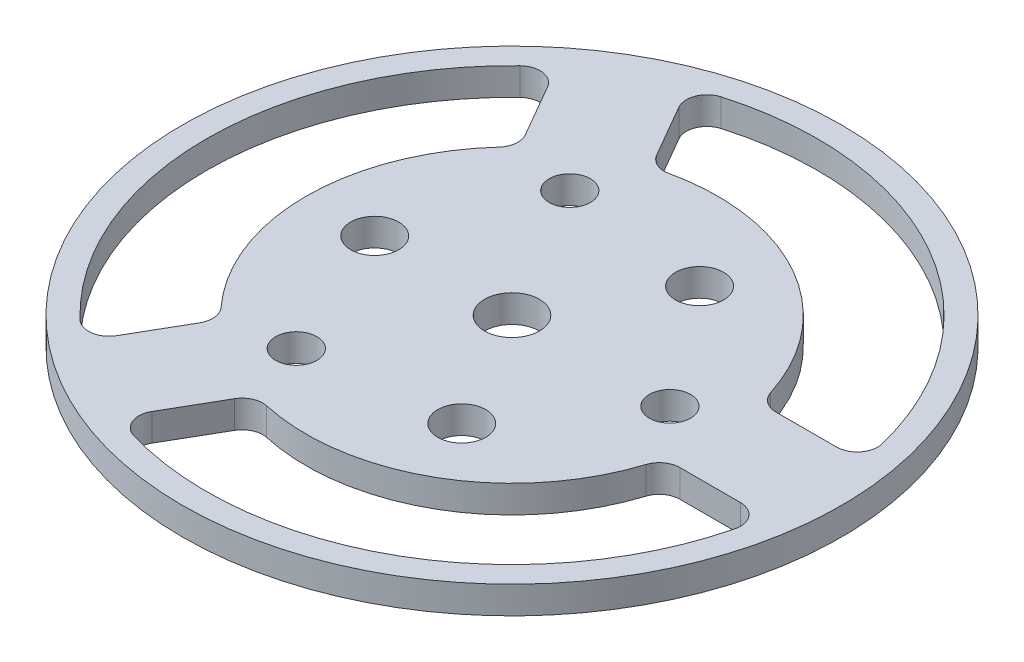
ISO-10303-21;
HEADER;
FILE_DESCRIPTION(('STEP AP214'),'2;1');
FILE_NAME('part.step','',(''),(''),'','','');
FILE_SCHEMA(('AUTOMOTIVE_DESIGN { 1 0 10303 214 1 1 1 1 }'));
ENDSEC;
DATA;
#1=APPLICATION_CONTEXT('core data for automotive mechanical design processes');
#2=APPLICATION_PROTOCOL_DEFINITION('international standard','automotive_design',2000,#1);
#3=PRODUCT_CONTEXT('',#1,'mechanical');
#4=PRODUCT('Part','Part','',(#3));
#5=PRODUCT_RELATED_PRODUCT_CATEGORY('part','',(#4));
#6=PRODUCT_DEFINITION_FORMATION('','',#4);
#7=PRODUCT_DEFINITION_CONTEXT('part definition',#1,'design');
#8=PRODUCT_DEFINITION('design','',#6,#7);
#9=PRODUCT_DEFINITION_SHAPE('','',#8);
#10=(LENGTH_UNIT() NAMED_UNIT(*) SI_UNIT(.MILLI.,.METRE.));
#11=(NAMED_UNIT(*) PLANE_ANGLE_UNIT() SI_UNIT($,.RADIAN.));
#12=(NAMED_UNIT(*) SI_UNIT($,.STERADIAN.) SOLID_ANGLE_UNIT());
#13=UNCERTAINTY_MEASURE_WITH_UNIT(LENGTH_MEASURE(1.E-05),#10,'distance_accuracy_value','');
#14=(GEOMETRIC_REPRESENTATION_CONTEXT(3) GLOBAL_UNCERTAINTY_ASSIGNED_CONTEXT((#13)) GLOBAL_UNIT_ASSIGNED_CONTEXT((#10,
#11,#12)) REPRESENTATION_CONTEXT('',''));
#15=CARTESIAN_POINT('',(0.,0.,0.));
#16=DIRECTION('',(0.,0.,1.));
#17=DIRECTION('',(1.,0.,0.));
#18=AXIS2_PLACEMENT_3D('',#15,#16,#17);
#19=CARTESIAN_POINT('',(0.,2.,0.));
#20=DIRECTION('',(0.,1.,0.));
#21=DIRECTION('',(0.,0.,1.));
#22=AXIS2_PLACEMENT_3D('',#19,#20,#21);
#23=PLANE('',#22);
#24=CARTESIAN_POINT('',(5.,2.,-8.66025403784439));
#25=DIRECTION('',(0.,1.,0.));
#26=DIRECTION('',(0.,0.,1.));
#27=AXIS2_PLACEMENT_3D('',#24,#25,#26);
#28=CIRCLE('',#27,1.75);
#29=CARTESIAN_POINT('',(5.,2.,-6.91025403784439));
#30=VERTEX_POINT('',#29);
#31=EDGE_CURVE('E373',#30,#30,#28,.T.);
#32=ORIENTED_EDGE('',*,*,#31,.F.);
#33=EDGE_LOOP('',(#32));
#34=FACE_BOUND('',#33,.T.);
#35=CARTESIAN_POINT('',(5.0000000000005,2.,8.66025403784439));
#36=DIRECTION('',(0.,1.,0.));
#37=DIRECTION('',(0.,0.,1.));
#38=AXIS2_PLACEMENT_3D('',#35,#36,#37);
#39=CIRCLE('',#38,1.75000000000014);
#40=CARTESIAN_POINT('',(5.0000000000005,2.,10.4102540378445));
#41=VERTEX_POINT('',#40);
#42=EDGE_CURVE('E575',#41,#41,#39,.T.);
#43=ORIENTED_EDGE('',*,*,#42,.F.);
#44=EDGE_LOOP('',(#43));
#45=FACE_BOUND('',#44,.T.);
#46=CARTESIAN_POINT('',(-9.99999999999975,2.,4.32252444309614E-13));
#47=DIRECTION('',(0.,1.,0.));
#48=DIRECTION('',(0.,0.,1.));
#49=AXIS2_PLACEMENT_3D('',#46,#47,#48);
#50=CIRCLE('',#49,1.75000000000053);
#51=CARTESIAN_POINT('',(-9.99999999999975,2.,1.75000000000096));
#52=VERTEX_POINT('',#51);
#53=EDGE_CURVE('E572',#52,#52,#50,.T.);
#54=ORIENTED_EDGE('',*,*,#53,.F.);
#55=EDGE_LOOP('',(#54));
#56=FACE_BOUND('',#55,.T.);
#57=CARTESIAN_POINT('',(0.,2.,0.));
#58=DIRECTION('',(0.,1.,0.));
#59=DIRECTION('',(0.,0.,1.));
#60=AXIS2_PLACEMENT_3D('',#57,#58,#59);
#61=CIRCLE('',#60,22.25);
#62=CARTESIAN_POINT('',(21.5943835085545,2.,-5.36144578313253));
#63=VERTEX_POINT('',#62);
#64=CARTESIAN_POINT('',(-6.15404350507153,2.,-21.3820075890382));
#65=VERTEX_POINT('',#64);
#66=EDGE_CURVE('E378',#63,#65,#61,.T.);
#67=ORIENTED_EDGE('',*,*,#66,.F.);
#68=CARTESIAN_POINT('',(20.1385823731463,2.,-5.));
#69=DIRECTION('',(0.,1.,0.));
#70=DIRECTION('',(0.,0.,1.));
#71=AXIS2_PLACEMENT_3D('',#68,#69,#70);
#72=CIRCLE('',#71,1.5);
#73=CARTESIAN_POINT('',(20.1385823731463,2.,-3.5));
#74=VERTEX_POINT('',#73);
#75=EDGE_CURVE('E322',#63,#74,#72,.F.);
#76=ORIENTED_EDGE('',*,*,#75,.T.);
#77=DIRECTION('',(1.,0.,0.));
#78=VECTOR('',#77,1.);
#79=CARTESIAN_POINT('',(21.9729947890587,2.,-3.5));
#80=LINE('',#79,#78);
#81=CARTESIAN_POINT('',(15.7241851935164,2.,-3.5));
#82=VERTEX_POINT('',#81);
#83=EDGE_CURVE('E395',#82,#74,#80,.T.);
#84=ORIENTED_EDGE('',*,*,#83,.F.);
#85=CARTESIAN_POINT('',(15.7241851935164,2.,-5.));
#86=DIRECTION('',(0.,1.,0.));
#87=DIRECTION('',(0.,0.,1.));
#88=AXIS2_PLACEMENT_3D('',#85,#86,#87);
#89=CIRCLE('',#88,1.5);
#90=CARTESIAN_POINT('',(14.2947138122876,2.,-4.54545454545454));
#91=VERTEX_POINT('',#90);
#92=EDGE_CURVE('E340',#82,#91,#89,.F.);
#93=ORIENTED_EDGE('',*,*,#92,.T.);
#94=CARTESIAN_POINT('',(0.,2.,0.));
#95=DIRECTION('',(0.,-1.,0.));
#96=DIRECTION('',(0.,0.,1.));
#97=AXIS2_PLACEMENT_3D('',#94,#95,#96);
#98=CIRCLE('',#97,15.);
#99=CARTESIAN_POINT('',(-3.21087779803273,2.,-14.6523125739967));
#100=VERTEX_POINT('',#99);
#101=EDGE_CURVE('E387',#100,#91,#98,.T.);
#102=ORIENTED_EDGE('',*,*,#101,.F.);
#103=CARTESIAN_POINT('',(-3.53196557783601,2.,-16.1175438313963));
#104=DIRECTION('',(0.,1.,0.));
#105=DIRECTION('',(0.,0.,1.));
#106=AXIS2_PLACEMENT_3D('',#103,#104,#105);
#107=CIRCLE('',#106,1.5);
#108=CARTESIAN_POINT('',(-4.83100368351267,2.,-15.3675438313963));
#109=VERTEX_POINT('',#108);
#110=EDGE_CURVE('E334',#100,#109,#107,.F.);
#111=ORIENTED_EDGE('',*,*,#110,.T.);
#112=DIRECTION('',(0.5,0.,0.866025403784438));
#113=VECTOR('',#112,1.);
#114=CARTESIAN_POINT('',(-7.95540848128382,2.,-20.7791716845479));
#115=LINE('',#114,#113);
#116=CARTESIAN_POINT('',(-7.03820227332764,2.,-19.1905239313502));
#117=VERTEX_POINT('',#116);
#118=EDGE_CURVE('E382',#117,#109,#115,.T.);
#119=ORIENTED_EDGE('',*,*,#118,.F.);
#120=CARTESIAN_POINT('',(-5.73916416765098,2.,-19.9405239313502));
#121=DIRECTION('',(0.,1.,0.));
#122=DIRECTION('',(0.,0.,1.));
#123=AXIS2_PLACEMENT_3D('',#120,#121,#122);
#124=CIRCLE('',#123,1.5);
#125=EDGE_CURVE('E310',#117,#65,#124,.F.);
#126=ORIENTED_EDGE('',*,*,#125,.T.);
#127=EDGE_LOOP('',(#67,#76,#84,#93,#102,#111,#119,#126));
#128=FACE_BOUND('',#127,.T.);
#129=CARTESIAN_POINT('',(0.,2.,0.));
#130=DIRECTION('',(0.,1.,0.));
#131=DIRECTION('',(0.,0.,1.));
#132=AXIS2_PLACEMENT_3D('',#129,#130,#131);
#133=CIRCLE('',#132,22.25);
#134=CARTESIAN_POINT('',(-15.440340003483,2.,-16.0205618059057));
#135=VERTEX_POINT('',#134);
#136=CARTESIAN_POINT('',(-15.440340003483,2.,16.0205618059057));
#137=VERTEX_POINT('',#136);
#138=EDGE_CURVE('E514',#135,#137,#133,.T.);
#139=ORIENTED_EDGE('',*,*,#138,.F.);
#140=CARTESIAN_POINT('',(-14.3994182054954,2.,-14.9405239313502));
#141=DIRECTION('',(0.,1.,0.));
#142=DIRECTION('',(0.,0.,1.));
#143=AXIS2_PLACEMENT_3D('',#140,#141,#142);
#144=CIRCLE('',#143,1.5);
#145=CARTESIAN_POINT('',(-13.1003800998187,2.,-15.6905239313502));
#146=VERTEX_POINT('',#145);
#147=EDGE_CURVE('E46',#135,#146,#144,.F.);
#148=ORIENTED_EDGE('',*,*,#147,.T.);
#149=DIRECTION('',(-0.499999999999998,0.,-0.86602540378444));
#150=VECTOR('',#149,1.);
#151=CARTESIAN_POINT('',(-14.0175863077749,2.,-17.2791716845479));
#152=LINE('',#151,#150);
#153=CARTESIAN_POINT('',(-10.8931815100037,2.,-11.8675438313963));
#154=VERTEX_POINT('',#153);
#155=EDGE_CURVE('E522',#154,#146,#152,.T.);
#156=ORIENTED_EDGE('',*,*,#155,.F.);
#157=CARTESIAN_POINT('',(-12.1922196156804,2.,-11.1175438313963));
#158=DIRECTION('',(0.,1.,0.));
#159=DIRECTION('',(0.,0.,1.));
#160=AXIS2_PLACEMENT_3D('',#157,#158,#159);
#161=CIRCLE('',#160,1.5);
#162=CARTESIAN_POINT('',(-11.0838360142549,2.,-10.1068580285421));
#163=VERTEX_POINT('',#162);
#164=EDGE_CURVE('E362',#154,#163,#161,.F.);
#165=ORIENTED_EDGE('',*,*,#164,.T.);
#166=CARTESIAN_POINT('',(0.,2.,0.));
#167=DIRECTION('',(0.,-1.,0.));
#168=DIRECTION('',(0.,0.,1.));
#169=AXIS2_PLACEMENT_3D('',#166,#167,#168);
#170=CIRCLE('',#169,15.);
#171=CARTESIAN_POINT('',(-11.0838360142549,2.,10.1068580285421));
#172=VERTEX_POINT('',#171);
#173=EDGE_CURVE('E520',#172,#163,#170,.T.);
#174=ORIENTED_EDGE('',*,*,#173,.F.);
#175=CARTESIAN_POINT('',(-12.1922196156804,2.,11.1175438313963));
#176=DIRECTION('',(0.,1.,0.));
#177=DIRECTION('',(0.,0.,1.));
#178=AXIS2_PLACEMENT_3D('',#175,#176,#177);
#179=CIRCLE('',#178,1.5);
#180=CARTESIAN_POINT('',(-10.8931815100037,2.,11.8675438313963));
#181=VERTEX_POINT('',#180);
#182=EDGE_CURVE('E356',#172,#181,#179,.F.);
#183=ORIENTED_EDGE('',*,*,#182,.T.);
#184=DIRECTION('',(0.499999999999999,0.,-0.866025403784439));
#185=VECTOR('',#184,1.);
#186=CARTESIAN_POINT('',(-14.0175863077749,2.,17.2791716845479));
#187=LINE('',#186,#185);
#188=CARTESIAN_POINT('',(-13.1003800998187,2.,15.6905239313502));
#189=VERTEX_POINT('',#188);
#190=EDGE_CURVE('E517',#189,#181,#187,.T.);
#191=ORIENTED_EDGE('',*,*,#190,.F.);
#192=CARTESIAN_POINT('',(-14.3994182054954,2.,14.9405239313502));
#193=DIRECTION('',(0.,1.,0.));
#194=DIRECTION('',(0.,0.,1.));
#195=AXIS2_PLACEMENT_3D('',#192,#193,#194);
#196=CIRCLE('',#195,1.5);
#197=EDGE_CURVE('E328',#189,#137,#196,.F.);
#198=ORIENTED_EDGE('',*,*,#197,.T.);
#199=EDGE_LOOP('',(#139,#148,#156,#165,#174,#183,#191,#198));
#200=FACE_BOUND('',#199,.T.);
#201=CARTESIAN_POINT('',(0.,2.,0.));
#202=DIRECTION('',(0.,1.,0.));
#203=DIRECTION('',(0.,0.,1.));
#204=AXIS2_PLACEMENT_3D('',#201,#202,#203);
#205=CIRCLE('',#204,22.25);
#206=CARTESIAN_POINT('',(-6.15404350507152,2.,21.3820075890382));
#207=VERTEX_POINT('',#206);
#208=CARTESIAN_POINT('',(21.5943835085545,2.,5.36144578313253));
#209=VERTEX_POINT('',#208);
#210=EDGE_CURVE('E405',#207,#209,#205,.T.);
#211=ORIENTED_EDGE('',*,*,#210,.F.);
#212=CARTESIAN_POINT('',(-5.73916416765096,2.,19.9405239313502));
#213=DIRECTION('',(0.,1.,0.));
#214=DIRECTION('',(0.,0.,1.));
#215=AXIS2_PLACEMENT_3D('',#212,#213,#214);
#216=CIRCLE('',#215,1.5);
#217=CARTESIAN_POINT('',(-7.03820227332762,2.,19.1905239313502));
#218=VERTEX_POINT('',#217);
#219=EDGE_CURVE('E227',#207,#218,#216,.F.);
#220=ORIENTED_EDGE('',*,*,#219,.T.);
#221=DIRECTION('',(-0.5,0.,0.866025403784439));
#222=VECTOR('',#221,1.);
#223=CARTESIAN_POINT('',(-7.9554084812838,2.,20.7791716845479));
#224=LINE('',#223,#222);
#225=CARTESIAN_POINT('',(-4.83100368351266,2.,15.3675438313963));
#226=VERTEX_POINT('',#225);
#227=EDGE_CURVE('E205',#226,#218,#224,.T.);
#228=ORIENTED_EDGE('',*,*,#227,.F.);
#229=CARTESIAN_POINT('',(-3.531965577836,2.,16.1175438313963));
#230=DIRECTION('',(0.,1.,0.));
#231=DIRECTION('',(0.,0.,1.));
#232=AXIS2_PLACEMENT_3D('',#229,#230,#231);
#233=CIRCLE('',#232,1.5);
#234=CARTESIAN_POINT('',(-3.21087779803272,2.,14.6523125739967));
#235=VERTEX_POINT('',#234);
#236=EDGE_CURVE('E216',#226,#235,#233,.F.);
#237=ORIENTED_EDGE('',*,*,#236,.T.);
#238=CARTESIAN_POINT('',(0.,2.,0.));
#239=DIRECTION('',(0.,-1.,0.));
#240=DIRECTION('',(0.,0.,1.));
#241=AXIS2_PLACEMENT_3D('',#238,#239,#240);
#242=CIRCLE('',#241,15.);
#243=CARTESIAN_POINT('',(14.2947138122876,2.,4.54545454545454));
#244=VERTEX_POINT('',#243);
#245=EDGE_CURVE('E229',#244,#235,#242,.T.);
#246=ORIENTED_EDGE('',*,*,#245,.F.);
#247=CARTESIAN_POINT('',(15.7241851935164,2.,5.));
#248=DIRECTION('',(0.,1.,0.));
#249=DIRECTION('',(0.,0.,1.));
#250=AXIS2_PLACEMENT_3D('',#247,#248,#249);
#251=CIRCLE('',#250,1.5);
#252=CARTESIAN_POINT('',(15.7241851935164,2.,3.5));
#253=VERTEX_POINT('',#252);
#254=EDGE_CURVE('E316',#244,#253,#251,.F.);
#255=ORIENTED_EDGE('',*,*,#254,.T.);
#256=DIRECTION('',(-1.,0.,0.));
#257=VECTOR('',#256,1.);
#258=CARTESIAN_POINT('',(21.9729947890587,2.,3.5));
#259=LINE('',#258,#257);
#260=CARTESIAN_POINT('',(20.1385823731463,2.,3.5));
#261=VERTEX_POINT('',#260);
#262=EDGE_CURVE('E234',#261,#253,#259,.T.);
#263=ORIENTED_EDGE('',*,*,#262,.F.);
#264=CARTESIAN_POINT('',(20.1385823731463,2.,5.));
#265=DIRECTION('',(0.,1.,0.));
#266=DIRECTION('',(0.,0.,1.));
#267=AXIS2_PLACEMENT_3D('',#264,#265,#266);
#268=CIRCLE('',#267,1.5);
#269=EDGE_CURVE('E350',#261,#209,#268,.F.);
#270=ORIENTED_EDGE('',*,*,#269,.T.);
#271=EDGE_LOOP('',(#211,#220,#228,#237,#246,#255,#263,#270));
#272=FACE_BOUND('',#271,.T.);
#273=CARTESIAN_POINT('',(-5.75000000000005,2.,9.95929214352102));
#274=DIRECTION('',(0.,1.,0.));
#275=DIRECTION('',(0.,0.,1.));
#276=AXIS2_PLACEMENT_3D('',#273,#274,#275);
#277=CIRCLE('',#276,1.5);
#278=CARTESIAN_POINT('',(-5.75000000000005,2.,11.459292143521));
#279=VERTEX_POINT('',#278);
#280=EDGE_CURVE('E245',#279,#279,#277,.T.);
#281=ORIENTED_EDGE('',*,*,#280,.F.);
#282=EDGE_LOOP('',(#281));
#283=FACE_BOUND('',#282,.T.);
#284=CARTESIAN_POINT('',(0.,2.,0.));
#285=DIRECTION('',(0.,1.,0.));
#286=DIRECTION('',(0.,0.,1.));
#287=AXIS2_PLACEMENT_3D('',#284,#285,#286);
#288=CIRCLE('',#287,2.);
#289=CARTESIAN_POINT('',(0.,2.,2.));
#290=VERTEX_POINT('',#289);
#291=EDGE_CURVE('E257',#290,#290,#288,.T.);
#292=ORIENTED_EDGE('',*,*,#291,.F.);
#293=EDGE_LOOP('',(#292));
#294=FACE_BOUND('',#293,.T.);
#295=CARTESIAN_POINT('',(0.,2.,0.));
#296=DIRECTION('',(0.,1.,0.));
#297=DIRECTION('',(0.,0.,1.));
#298=AXIS2_PLACEMENT_3D('',#295,#296,#297);
#299=CIRCLE('',#298,24.);
#300=CARTESIAN_POINT('',(0.,2.,24.));
#301=VERTEX_POINT('',#300);
#302=EDGE_CURVE('E263',#301,#301,#299,.T.);
#303=ORIENTED_EDGE('',*,*,#302,.T.);
#304=EDGE_LOOP('',(#303));
#305=FACE_BOUND('',#304,.T.);
#306=CARTESIAN_POINT('',(11.5,2.,0.));
#307=DIRECTION('',(0.,1.,0.));
#308=DIRECTION('',(0.,0.,1.));
#309=AXIS2_PLACEMENT_3D('',#306,#307,#308);
#310=CIRCLE('',#309,1.5);
#311=CARTESIAN_POINT('',(11.5,2.,1.5));
#312=VERTEX_POINT('',#311);
#313=EDGE_CURVE('E251',#312,#312,#310,.T.);
#314=ORIENTED_EDGE('',*,*,#313,.F.);
#315=EDGE_LOOP('',(#314));
#316=FACE_BOUND('',#315,.T.);
#317=CARTESIAN_POINT('',(-5.74999999999991,2.,-9.95929214352109));
#318=DIRECTION('',(0.,1.,0.));
#319=DIRECTION('',(0.,0.,1.));
#320=AXIS2_PLACEMENT_3D('',#317,#318,#319);
#321=CIRCLE('',#320,1.5);
#322=CARTESIAN_POINT('',(-5.74999999999991,2.,-8.4592921435211));
#323=VERTEX_POINT('',#322);
#324=EDGE_CURVE('E238',#323,#323,#321,.T.);
#325=ORIENTED_EDGE('',*,*,#324,.F.);
#326=EDGE_LOOP('',(#325));
#327=FACE_BOUND('',#326,.T.);
#328=ADVANCED_FACE('F37',(#34,#45,#56,#128,#200,#272,#283,#294,#305,#316,#327),#23,.T.);
#329=CARTESIAN_POINT('',(0.,0.,0.));
#330=DIRECTION('',(0.,1.,0.));
#331=DIRECTION('',(0.,0.,1.));
#332=AXIS2_PLACEMENT_3D('',#329,#330,#331);
#333=PLANE('',#332);
#334=CARTESIAN_POINT('',(5.,0.,-8.66025403784439));
#335=DIRECTION('',(0.,1.,0.));
#336=DIRECTION('',(0.,0.,1.));
#337=AXIS2_PLACEMENT_3D('',#334,#335,#336);
#338=CIRCLE('',#337,1.75);
#339=CARTESIAN_POINT('',(5.,0.,-6.91025403784439));
#340=VERTEX_POINT('',#339);
#341=EDGE_CURVE('E41',#340,#340,#338,.T.);
#342=ORIENTED_EDGE('',*,*,#341,.T.);
#343=EDGE_LOOP('',(#342));
#344=FACE_BOUND('',#343,.T.);
#345=CARTESIAN_POINT('',(5.0000000000005,0.,8.66025403784439));
#346=DIRECTION('',(0.,1.,0.));
#347=DIRECTION('',(0.,0.,1.));
#348=AXIS2_PLACEMENT_3D('',#345,#346,#347);
#349=CIRCLE('',#348,1.75000000000014);
#350=CARTESIAN_POINT('',(5.0000000000005,0.,10.4102540378445));
#351=VERTEX_POINT('',#350);
#352=EDGE_CURVE('E372',#351,#351,#349,.T.);
#353=ORIENTED_EDGE('',*,*,#352,.T.);
#354=EDGE_LOOP('',(#353));
#355=FACE_BOUND('',#354,.T.);
#356=CARTESIAN_POINT('',(-9.99999999999975,0.,4.32252444309614E-13));
#357=DIRECTION('',(0.,1.,0.));
#358=DIRECTION('',(0.,0.,1.));
#359=AXIS2_PLACEMENT_3D('',#356,#357,#358);
#360=CIRCLE('',#359,1.75000000000053);
#361=CARTESIAN_POINT('',(-9.99999999999975,0.,1.75000000000096));
#362=VERTEX_POINT('',#361);
#363=EDGE_CURVE('E370',#362,#362,#360,.T.);
#364=ORIENTED_EDGE('',*,*,#363,.T.);
#365=EDGE_LOOP('',(#364));
#366=FACE_BOUND('',#365,.T.);
#367=CARTESIAN_POINT('',(0.,0.,0.));
#368=DIRECTION('',(0.,-1.,0.));
#369=DIRECTION('',(0.,0.,1.));
#370=AXIS2_PLACEMENT_3D('',#367,#368,#369);
#371=CIRCLE('',#370,15.);
#372=CARTESIAN_POINT('',(-3.21087779803273,0.,-14.6523125739967));
#373=VERTEX_POINT('',#372);
#374=CARTESIAN_POINT('',(14.2947138122876,0.,-4.54545454545454));
#375=VERTEX_POINT('',#374);
#376=EDGE_CURVE('E528',#373,#375,#371,.T.);
#377=ORIENTED_EDGE('',*,*,#376,.T.);
#378=CARTESIAN_POINT('',(15.7241851935164,0.,-5.));
#379=DIRECTION('',(0.,1.,0.));
#380=DIRECTION('',(0.,0.,1.));
#381=AXIS2_PLACEMENT_3D('',#378,#379,#380);
#382=CIRCLE('',#381,1.5);
#383=CARTESIAN_POINT('',(15.7241851935164,0.,-3.5));
#384=VERTEX_POINT('',#383);
#385=EDGE_CURVE('E343',#375,#384,#382,.T.);
#386=ORIENTED_EDGE('',*,*,#385,.T.);
#387=DIRECTION('',(1.,0.,0.));
#388=VECTOR('',#387,1.);
#389=CARTESIAN_POINT('',(21.9729947890587,0.,-3.5));
#390=LINE('',#389,#388);
#391=CARTESIAN_POINT('',(20.1385823731463,0.,-3.5));
#392=VERTEX_POINT('',#391);
#393=EDGE_CURVE('E390',#384,#392,#390,.T.);
#394=ORIENTED_EDGE('',*,*,#393,.T.);
#395=CARTESIAN_POINT('',(20.1385823731463,0.,-5.));
#396=DIRECTION('',(0.,1.,0.));
#397=DIRECTION('',(0.,0.,1.));
#398=AXIS2_PLACEMENT_3D('',#395,#396,#397);
#399=CIRCLE('',#398,1.5);
#400=CARTESIAN_POINT('',(21.5943835085545,0.,-5.36144578313253));
#401=VERTEX_POINT('',#400);
#402=EDGE_CURVE('E325',#392,#401,#399,.T.);
#403=ORIENTED_EDGE('',*,*,#402,.T.);
#404=CARTESIAN_POINT('',(0.,0.,0.));
#405=DIRECTION('',(0.,1.,0.));
#406=DIRECTION('',(0.,0.,1.));
#407=AXIS2_PLACEMENT_3D('',#404,#405,#406);
#408=CIRCLE('',#407,22.25);
#409=CARTESIAN_POINT('',(-6.15404350507153,0.,-21.3820075890382));
#410=VERTEX_POINT('',#409);
#411=EDGE_CURVE('E397',#401,#410,#408,.T.);
#412=ORIENTED_EDGE('',*,*,#411,.T.);
#413=CARTESIAN_POINT('',(-5.73916416765098,0.,-19.9405239313502));
#414=DIRECTION('',(0.,1.,0.));
#415=DIRECTION('',(0.,0.,1.));
#416=AXIS2_PLACEMENT_3D('',#413,#414,#415);
#417=CIRCLE('',#416,1.5);
#418=CARTESIAN_POINT('',(-7.03820227332764,0.,-19.1905239313502));
#419=VERTEX_POINT('',#418);
#420=EDGE_CURVE('E313',#410,#419,#417,.T.);
#421=ORIENTED_EDGE('',*,*,#420,.T.);
#422=DIRECTION('',(0.5,0.,0.866025403784438));
#423=VECTOR('',#422,1.);
#424=CARTESIAN_POINT('',(-7.95540848128382,0.,-20.7791716845479));
#425=LINE('',#424,#423);
#426=CARTESIAN_POINT('',(-4.83100368351267,0.,-15.3675438313963));
#427=VERTEX_POINT('',#426);
#428=EDGE_CURVE('E526',#419,#427,#425,.T.);
#429=ORIENTED_EDGE('',*,*,#428,.T.);
#430=CARTESIAN_POINT('',(-3.53196557783601,0.,-16.1175438313963));
#431=DIRECTION('',(0.,1.,0.));
#432=DIRECTION('',(0.,0.,1.));
#433=AXIS2_PLACEMENT_3D('',#430,#431,#432);
#434=CIRCLE('',#433,1.5);
#435=EDGE_CURVE('E337',#427,#373,#434,.T.);
#436=ORIENTED_EDGE('',*,*,#435,.T.);
#437=EDGE_LOOP('',(#377,#386,#394,#403,#412,#421,#429,#436));
#438=FACE_BOUND('',#437,.T.);
#439=CARTESIAN_POINT('',(0.,0.,0.));
#440=DIRECTION('',(0.,-1.,0.));
#441=DIRECTION('',(0.,0.,1.));
#442=AXIS2_PLACEMENT_3D('',#439,#440,#441);
#443=CIRCLE('',#442,15.);
#444=CARTESIAN_POINT('',(-11.0838360142549,0.,10.1068580285421));
#445=VERTEX_POINT('',#444);
#446=CARTESIAN_POINT('',(-11.0838360142549,0.,-10.1068580285421));
#447=VERTEX_POINT('',#446);
#448=EDGE_CURVE('E503',#445,#447,#443,.T.);
#449=ORIENTED_EDGE('',*,*,#448,.T.);
#450=CARTESIAN_POINT('',(-12.1922196156804,0.,-11.1175438313963));
#451=DIRECTION('',(0.,1.,0.));
#452=DIRECTION('',(0.,0.,1.));
#453=AXIS2_PLACEMENT_3D('',#450,#451,#452);
#454=CIRCLE('',#453,1.5);
#455=CARTESIAN_POINT('',(-10.8931815100037,0.,-11.8675438313963));
#456=VERTEX_POINT('',#455);
#457=EDGE_CURVE('E365',#447,#456,#454,.T.);
#458=ORIENTED_EDGE('',*,*,#457,.T.);
#459=DIRECTION('',(-0.499999999999998,0.,-0.86602540378444));
#460=VECTOR('',#459,1.);
#461=CARTESIAN_POINT('',(-14.0175863077749,0.,-17.2791716845479));
#462=LINE('',#461,#460);
#463=CARTESIAN_POINT('',(-13.1003800998187,0.,-15.6905239313502));
#464=VERTEX_POINT('',#463);
#465=EDGE_CURVE('E407',#456,#464,#462,.T.);
#466=ORIENTED_EDGE('',*,*,#465,.T.);
#467=CARTESIAN_POINT('',(-14.3994182054954,0.,-14.9405239313502));
#468=DIRECTION('',(0.,1.,0.));
#469=DIRECTION('',(0.,0.,1.));
#470=AXIS2_PLACEMENT_3D('',#467,#468,#469);
#471=CIRCLE('',#470,1.5);
#472=CARTESIAN_POINT('',(-15.440340003483,0.,-16.0205618059057));
#473=VERTEX_POINT('',#472);
#474=EDGE_CURVE('E11',#464,#473,#471,.T.);
#475=ORIENTED_EDGE('',*,*,#474,.T.);
#476=CARTESIAN_POINT('',(0.,0.,0.));
#477=DIRECTION('',(0.,1.,0.));
#478=DIRECTION('',(0.,0.,1.));
#479=AXIS2_PLACEMENT_3D('',#476,#477,#478);
#480=CIRCLE('',#479,22.25);
#481=CARTESIAN_POINT('',(-15.440340003483,0.,16.0205618059057));
#482=VERTEX_POINT('',#481);
#483=EDGE_CURVE('E510',#473,#482,#480,.T.);
#484=ORIENTED_EDGE('',*,*,#483,.T.);
#485=CARTESIAN_POINT('',(-14.3994182054954,0.,14.9405239313502));
#486=DIRECTION('',(0.,1.,0.));
#487=DIRECTION('',(0.,0.,1.));
#488=AXIS2_PLACEMENT_3D('',#485,#486,#487);
#489=CIRCLE('',#488,1.5);
#490=CARTESIAN_POINT('',(-13.1003800998187,0.,15.6905239313502));
#491=VERTEX_POINT('',#490);
#492=EDGE_CURVE('E331',#482,#491,#489,.T.);
#493=ORIENTED_EDGE('',*,*,#492,.T.);
#494=DIRECTION('',(0.499999999999999,0.,-0.866025403784439));
#495=VECTOR('',#494,1.);
#496=CARTESIAN_POINT('',(-14.0175863077749,0.,17.2791716845479));
#497=LINE('',#496,#495);
#498=CARTESIAN_POINT('',(-10.8931815100037,0.,11.8675438313963));
#499=VERTEX_POINT('',#498);
#500=EDGE_CURVE('E507',#491,#499,#497,.T.);
#501=ORIENTED_EDGE('',*,*,#500,.T.);
#502=CARTESIAN_POINT('',(-12.1922196156804,0.,11.1175438313963));
#503=DIRECTION('',(0.,1.,0.));
#504=DIRECTION('',(0.,0.,1.));
#505=AXIS2_PLACEMENT_3D('',#502,#503,#504);
#506=CIRCLE('',#505,1.5);
#507=EDGE_CURVE('E359',#499,#445,#506,.T.);
#508=ORIENTED_EDGE('',*,*,#507,.T.);
#509=EDGE_LOOP('',(#449,#458,#466,#475,#484,#493,#501,#508));
#510=FACE_BOUND('',#509,.T.);
#511=CARTESIAN_POINT('',(0.,0.,0.));
#512=DIRECTION('',(0.,-1.,0.));
#513=DIRECTION('',(0.,0.,1.));
#514=AXIS2_PLACEMENT_3D('',#511,#512,#513);
#515=CIRCLE('',#514,15.);
#516=CARTESIAN_POINT('',(14.2947138122876,0.,4.54545454545454));
#517=VERTEX_POINT('',#516);
#518=CARTESIAN_POINT('',(-3.21087779803272,0.,14.6523125739967));
#519=VERTEX_POINT('',#518);
#520=EDGE_CURVE('E401',#517,#519,#515,.T.);
#521=ORIENTED_EDGE('',*,*,#520,.T.);
#522=CARTESIAN_POINT('',(-3.531965577836,0.,16.1175438313963));
#523=DIRECTION('',(0.,1.,0.));
#524=DIRECTION('',(0.,0.,1.));
#525=AXIS2_PLACEMENT_3D('',#522,#523,#524);
#526=CIRCLE('',#525,1.5);
#527=CARTESIAN_POINT('',(-4.83100368351266,0.,15.3675438313963));
#528=VERTEX_POINT('',#527);
#529=EDGE_CURVE('E222',#519,#528,#526,.T.);
#530=ORIENTED_EDGE('',*,*,#529,.T.);
#531=DIRECTION('',(-0.5,0.,0.866025403784439));
#532=VECTOR('',#531,1.);
#533=CARTESIAN_POINT('',(-7.9554084812838,0.,20.7791716845479));
#534=LINE('',#533,#532);
#535=CARTESIAN_POINT('',(-7.03820227332762,0.,19.1905239313502));
#536=VERTEX_POINT('',#535);
#537=EDGE_CURVE('E208',#528,#536,#534,.T.);
#538=ORIENTED_EDGE('',*,*,#537,.T.);
#539=CARTESIAN_POINT('',(-5.73916416765096,0.,19.9405239313502));
#540=DIRECTION('',(0.,1.,0.));
#541=DIRECTION('',(0.,0.,1.));
#542=AXIS2_PLACEMENT_3D('',#539,#540,#541);
#543=CIRCLE('',#542,1.5);
#544=CARTESIAN_POINT('',(-6.15404350507152,0.,21.3820075890382));
#545=VERTEX_POINT('',#544);
#546=EDGE_CURVE('E347',#536,#545,#543,.T.);
#547=ORIENTED_EDGE('',*,*,#546,.T.);
#548=CARTESIAN_POINT('',(0.,0.,0.));
#549=DIRECTION('',(0.,1.,0.));
#550=DIRECTION('',(0.,0.,1.));
#551=AXIS2_PLACEMENT_3D('',#548,#549,#550);
#552=CIRCLE('',#551,22.25);
#553=CARTESIAN_POINT('',(21.5943835085545,0.,5.36144578313253));
#554=VERTEX_POINT('',#553);
#555=EDGE_CURVE('E228',#545,#554,#552,.T.);
#556=ORIENTED_EDGE('',*,*,#555,.T.);
#557=CARTESIAN_POINT('',(20.1385823731463,0.,5.));
#558=DIRECTION('',(0.,1.,0.));
#559=DIRECTION('',(0.,0.,1.));
#560=AXIS2_PLACEMENT_3D('',#557,#558,#559);
#561=CIRCLE('',#560,1.5);
#562=CARTESIAN_POINT('',(20.1385823731463,0.,3.5));
#563=VERTEX_POINT('',#562);
#564=EDGE_CURVE('E353',#554,#563,#561,.T.);
#565=ORIENTED_EDGE('',*,*,#564,.T.);
#566=DIRECTION('',(-1.,0.,0.));
#567=VECTOR('',#566,1.);
#568=CARTESIAN_POINT('',(21.9729947890587,0.,3.5));
#569=LINE('',#568,#567);
#570=CARTESIAN_POINT('',(15.7241851935164,0.,3.5));
#571=VERTEX_POINT('',#570);
#572=EDGE_CURVE('E232',#563,#571,#569,.T.);
#573=ORIENTED_EDGE('',*,*,#572,.T.);
#574=CARTESIAN_POINT('',(15.7241851935164,0.,5.));
#575=DIRECTION('',(0.,1.,0.));
#576=DIRECTION('',(0.,0.,1.));
#577=AXIS2_PLACEMENT_3D('',#574,#575,#576);
#578=CIRCLE('',#577,1.5);
#579=EDGE_CURVE('E319',#571,#517,#578,.T.);
#580=ORIENTED_EDGE('',*,*,#579,.T.);
#581=EDGE_LOOP('',(#521,#530,#538,#547,#556,#565,#573,#580));
#582=FACE_BOUND('',#581,.T.);
#583=CARTESIAN_POINT('',(0.,0.,0.));
#584=DIRECTION('',(0.,1.,0.));
#585=DIRECTION('',(0.,0.,1.));
#586=AXIS2_PLACEMENT_3D('',#583,#584,#585);
#587=CIRCLE('',#586,24.);
#588=CARTESIAN_POINT('',(0.,0.,24.));
#589=VERTEX_POINT('',#588);
#590=EDGE_CURVE('E260',#589,#589,#587,.T.);
#591=ORIENTED_EDGE('',*,*,#590,.F.);
#592=EDGE_LOOP('',(#591));
#593=FACE_BOUND('',#592,.T.);
#594=CARTESIAN_POINT('',(0.,0.,0.));
#595=DIRECTION('',(0.,1.,0.));
#596=DIRECTION('',(0.,0.,1.));
#597=AXIS2_PLACEMENT_3D('',#594,#595,#596);
#598=CIRCLE('',#597,2.);
#599=CARTESIAN_POINT('',(0.,0.,2.));
#600=VERTEX_POINT('',#599);
#601=EDGE_CURVE('E254',#600,#600,#598,.T.);
#602=ORIENTED_EDGE('',*,*,#601,.T.);
#603=EDGE_LOOP('',(#602));
#604=FACE_BOUND('',#603,.T.);
#605=CARTESIAN_POINT('',(11.5,0.,0.));
#606=DIRECTION('',(0.,1.,0.));
#607=DIRECTION('',(0.,0.,1.));
#608=AXIS2_PLACEMENT_3D('',#605,#606,#607);
#609=CIRCLE('',#608,1.5);
#610=CARTESIAN_POINT('',(11.5,0.,1.5));
#611=VERTEX_POINT('',#610);
#612=EDGE_CURVE('E248',#611,#611,#609,.T.);
#613=ORIENTED_EDGE('',*,*,#612,.T.);
#614=EDGE_LOOP('',(#613));
#615=FACE_BOUND('',#614,.T.);
#616=CARTESIAN_POINT('',(-5.75000000000005,0.,9.95929214352102));
#617=DIRECTION('',(0.,1.,0.));
#618=DIRECTION('',(0.,0.,1.));
#619=AXIS2_PLACEMENT_3D('',#616,#617,#618);
#620=CIRCLE('',#619,1.5);
#621=CARTESIAN_POINT('',(-5.75000000000005,0.,11.459292143521));
#622=VERTEX_POINT('',#621);
#623=EDGE_CURVE('E241',#622,#622,#620,.T.);
#624=ORIENTED_EDGE('',*,*,#623,.T.);
#625=EDGE_LOOP('',(#624));
#626=FACE_BOUND('',#625,.T.);
#627=CARTESIAN_POINT('',(-5.74999999999991,0.,-9.95929214352109));
#628=DIRECTION('',(0.,1.,0.));
#629=DIRECTION('',(0.,0.,1.));
#630=AXIS2_PLACEMENT_3D('',#627,#628,#629);
#631=CIRCLE('',#630,1.5);
#632=CARTESIAN_POINT('',(-5.74999999999991,0.,-8.4592921435211));
#633=VERTEX_POINT('',#632);
#634=EDGE_CURVE('E242',#633,#633,#631,.T.);
#635=ORIENTED_EDGE('',*,*,#634,.T.);
#636=EDGE_LOOP('',(#635));
#637=FACE_BOUND('',#636,.T.);
#638=ADVANCED_FACE('F420',(#344,#355,#366,#438,#510,#582,#593,#604,#615,#626,#637),#333,.F.);
#639=CARTESIAN_POINT('',(0.,2.,0.));
#640=DIRECTION('',(0.,-1.,0.));
#641=DIRECTION('',(0.,0.,-1.));
#642=AXIS2_PLACEMENT_3D('',#639,#640,#641);
#643=CYLINDRICAL_SURFACE('',#642,24.);
#644=ORIENTED_EDGE('',*,*,#302,.F.);
#645=EDGE_LOOP('',(#644));
#646=FACE_BOUND('',#645,.T.);
#647=ORIENTED_EDGE('',*,*,#590,.T.);
#648=EDGE_LOOP('',(#647));
#649=FACE_BOUND('',#648,.T.);
#650=ADVANCED_FACE('F448',(#646,#649),#643,.T.);
#651=CARTESIAN_POINT('',(0.,2.,0.));
#652=DIRECTION('',(0.,-1.,0.));
#653=DIRECTION('',(0.,0.,-1.));
#654=AXIS2_PLACEMENT_3D('',#651,#652,#653);
#655=CYLINDRICAL_SURFACE('',#654,2.);
#656=ORIENTED_EDGE('',*,*,#291,.T.);
#657=EDGE_LOOP('',(#656));
#658=FACE_BOUND('',#657,.T.);
#659=ORIENTED_EDGE('',*,*,#601,.F.);
#660=EDGE_LOOP('',(#659));
#661=FACE_BOUND('',#660,.T.);
#662=ADVANCED_FACE('F453',(#658,#661),#655,.F.);
#663=CARTESIAN_POINT('',(11.5,2.,0.));
#664=DIRECTION('',(0.,-1.,0.));
#665=DIRECTION('',(0.,0.,-1.));
#666=AXIS2_PLACEMENT_3D('',#663,#664,#665);
#667=CYLINDRICAL_SURFACE('',#666,1.5);
#668=ORIENTED_EDGE('',*,*,#313,.T.);
#669=EDGE_LOOP('',(#668));
#670=FACE_BOUND('',#669,.T.);
#671=ORIENTED_EDGE('',*,*,#612,.F.);
#672=EDGE_LOOP('',(#671));
#673=FACE_BOUND('',#672,.T.);
#674=ADVANCED_FACE('F777',(#670,#673),#667,.F.);
#675=CARTESIAN_POINT('',(-5.75000000000005,2.,9.95929214352102));
#676=DIRECTION('',(0.,-1.,0.));
#677=DIRECTION('',(0.,0.,-1.));
#678=AXIS2_PLACEMENT_3D('',#675,#676,#677);
#679=CYLINDRICAL_SURFACE('',#678,1.5);
#680=ORIENTED_EDGE('',*,*,#280,.T.);
#681=EDGE_LOOP('',(#680));
#682=FACE_BOUND('',#681,.T.);
#683=ORIENTED_EDGE('',*,*,#623,.F.);
#684=EDGE_LOOP('',(#683));
#685=FACE_BOUND('',#684,.T.);
#686=ADVANCED_FACE('F768',(#682,#685),#679,.F.);
#687=CARTESIAN_POINT('',(-5.74999999999991,2.,-9.95929214352109));
#688=DIRECTION('',(0.,-1.,0.));
#689=DIRECTION('',(0.,0.,-1.));
#690=AXIS2_PLACEMENT_3D('',#687,#688,#689);
#691=CYLINDRICAL_SURFACE('',#690,1.5);
#692=ORIENTED_EDGE('',*,*,#324,.T.);
#693=EDGE_LOOP('',(#692));
#694=FACE_BOUND('',#693,.T.);
#695=ORIENTED_EDGE('',*,*,#634,.F.);
#696=EDGE_LOOP('',(#695));
#697=FACE_BOUND('',#696,.T.);
#698=ADVANCED_FACE('F760',(#694,#697),#691,.F.);
#699=CARTESIAN_POINT('',(0.,0.,0.));
#700=DIRECTION('',(0.,1.,0.));
#701=DIRECTION('',(0.,0.,1.));
#702=AXIS2_PLACEMENT_3D('',#699,#700,#701);
#703=CYLINDRICAL_SURFACE('',#702,22.25);
#704=ORIENTED_EDGE('',*,*,#555,.F.);
#705=DIRECTION('',(0.,1.,0.));
#706=VECTOR('',#705,1.);
#707=CARTESIAN_POINT('',(-6.15404350507151,0.,21.3820075890382));
#708=LINE('',#707,#706);
#709=EDGE_CURVE('E301',#545,#207,#708,.T.);
#710=ORIENTED_EDGE('',*,*,#709,.T.);
#711=ORIENTED_EDGE('',*,*,#210,.T.);
#712=DIRECTION('',(0.,1.,0.));
#713=VECTOR('',#712,1.);
#714=CARTESIAN_POINT('',(21.5943835085545,0.,5.36144578313253));
#715=LINE('',#714,#713);
#716=EDGE_CURVE('E299',#209,#554,#715,.F.);
#717=ORIENTED_EDGE('',*,*,#716,.T.);
#718=EDGE_LOOP('',(#704,#710,#711,#717));
#719=FACE_BOUND('',#718,.T.);
#720=ADVANCED_FACE('F427',(#719),#703,.F.);
#721=CARTESIAN_POINT('',(-7.9554084812838,0.,20.7791716845479));
#722=DIRECTION('',(-0.866025403784439,0.,-0.5));
#723=DIRECTION('',(-0.5,0.,0.866025403784439));
#724=AXIS2_PLACEMENT_3D('',#721,#722,#723);
#725=PLANE('',#724);
#726=ORIENTED_EDGE('',*,*,#537,.F.);
#727=DIRECTION('',(0.,-1.,0.));
#728=VECTOR('',#727,1.);
#729=CARTESIAN_POINT('',(-4.83100368351266,2.,15.3675438313963));
#730=LINE('',#729,#728);
#731=EDGE_CURVE('E201',#528,#226,#730,.F.);
#732=ORIENTED_EDGE('',*,*,#731,.T.);
#733=ORIENTED_EDGE('',*,*,#227,.T.);
#734=DIRECTION('',(0.,-1.,0.));
#735=VECTOR('',#734,1.);
#736=CARTESIAN_POINT('',(-7.03820227332762,0.,19.1905239313502));
#737=LINE('',#736,#735);
#738=EDGE_CURVE('E213',#218,#536,#737,.T.);
#739=ORIENTED_EDGE('',*,*,#738,.T.);
#740=EDGE_LOOP('',(#726,#732,#733,#739));
#741=FACE_BOUND('',#740,.T.);
#742=ADVANCED_FACE('F203',(#741),#725,.F.);
#743=CARTESIAN_POINT('',(0.,0.,0.));
#744=DIRECTION('',(0.,1.,0.));
#745=DIRECTION('',(0.,0.,1.));
#746=AXIS2_PLACEMENT_3D('',#743,#744,#745);
#747=CYLINDRICAL_SURFACE('',#746,15.);
#748=ORIENTED_EDGE('',*,*,#245,.T.);
#749=DIRECTION('',(0.,1.,0.));
#750=VECTOR('',#749,1.);
#751=CARTESIAN_POINT('',(-3.21087779803272,0.,14.6523125739967));
#752=LINE('',#751,#750);
#753=EDGE_CURVE('E218',#235,#519,#752,.F.);
#754=ORIENTED_EDGE('',*,*,#753,.T.);
#755=ORIENTED_EDGE('',*,*,#520,.F.);
#756=DIRECTION('',(0.,1.,0.));
#757=VECTOR('',#756,1.);
#758=CARTESIAN_POINT('',(14.2947138122876,0.,4.54545454545454));
#759=LINE('',#758,#757);
#760=EDGE_CURVE('E212',#517,#244,#759,.T.);
#761=ORIENTED_EDGE('',*,*,#760,.T.);
#762=EDGE_LOOP('',(#748,#754,#755,#761));
#763=FACE_BOUND('',#762,.T.);
#764=ADVANCED_FACE('F432',(#763),#747,.T.);
#765=CARTESIAN_POINT('',(21.9729947890587,0.,3.5));
#766=DIRECTION('',(0.,0.,-1.));
#767=DIRECTION('',(-1.,0.,0.));
#768=AXIS2_PLACEMENT_3D('',#765,#766,#767);
#769=PLANE('',#768);
#770=ORIENTED_EDGE('',*,*,#262,.T.);
#771=DIRECTION('',(0.,-1.,0.));
#772=VECTOR('',#771,1.);
#773=CARTESIAN_POINT('',(15.7241851935164,0.,3.5));
#774=LINE('',#773,#772);
#775=EDGE_CURVE('E281',#253,#571,#774,.T.);
#776=ORIENTED_EDGE('',*,*,#775,.T.);
#777=ORIENTED_EDGE('',*,*,#572,.F.);
#778=DIRECTION('',(0.,-1.,0.));
#779=VECTOR('',#778,1.);
#780=CARTESIAN_POINT('',(20.1385823731463,2.,3.5));
#781=LINE('',#780,#779);
#782=EDGE_CURVE('E279',#563,#261,#781,.F.);
#783=ORIENTED_EDGE('',*,*,#782,.T.);
#784=EDGE_LOOP('',(#770,#776,#777,#783));
#785=FACE_BOUND('',#784,.T.);
#786=ADVANCED_FACE('F411',(#785),#769,.F.);
#787=CARTESIAN_POINT('',(0.,0.,0.));
#788=DIRECTION('',(0.,1.,0.));
#789=DIRECTION('',(0.,0.,1.));
#790=AXIS2_PLACEMENT_3D('',#787,#788,#789);
#791=CYLINDRICAL_SURFACE('',#790,22.25);
#792=ORIENTED_EDGE('',*,*,#138,.T.);
#793=DIRECTION('',(0.,1.,0.));
#794=VECTOR('',#793,1.);
#795=CARTESIAN_POINT('',(-15.440340003483,0.,16.0205618059057));
#796=LINE('',#795,#794);
#797=EDGE_CURVE('E293',#137,#482,#796,.F.);
#798=ORIENTED_EDGE('',*,*,#797,.T.);
#799=ORIENTED_EDGE('',*,*,#483,.F.);
#800=DIRECTION('',(0.,1.,0.));
#801=VECTOR('',#800,1.);
#802=CARTESIAN_POINT('',(-15.440340003483,0.,-16.0205618059057));
#803=LINE('',#802,#801);
#804=EDGE_CURVE('E291',#473,#135,#803,.T.);
#805=ORIENTED_EDGE('',*,*,#804,.T.);
#806=EDGE_LOOP('',(#792,#798,#799,#805));
#807=FACE_BOUND('',#806,.T.);
#808=ADVANCED_FACE('F439',(#807),#791,.F.);
#809=CARTESIAN_POINT('',(-14.0175863077749,0.,-17.2791716845479));
#810=DIRECTION('',(0.86602540378444,0.,-0.499999999999998));
#811=DIRECTION('',(-0.499999999999998,0.,-0.86602540378444));
#812=AXIS2_PLACEMENT_3D('',#809,#810,#811);
#813=PLANE('',#812);
#814=ORIENTED_EDGE('',*,*,#465,.F.);
#815=DIRECTION('',(0.,-1.,0.));
#816=VECTOR('',#815,1.);
#817=CARTESIAN_POINT('',(-10.8931815100037,2.,-11.8675438313963));
#818=LINE('',#817,#816);
#819=EDGE_CURVE('E62',#456,#154,#818,.F.);
#820=ORIENTED_EDGE('',*,*,#819,.T.);
#821=ORIENTED_EDGE('',*,*,#155,.T.);
#822=DIRECTION('',(0.,-1.,0.));
#823=VECTOR('',#822,1.);
#824=CARTESIAN_POINT('',(-13.1003800998187,0.,-15.6905239313502));
#825=LINE('',#824,#823);
#826=EDGE_CURVE('E54',#146,#464,#825,.T.);
#827=ORIENTED_EDGE('',*,*,#826,.T.);
#828=EDGE_LOOP('',(#814,#820,#821,#827));
#829=FACE_BOUND('',#828,.T.);
#830=ADVANCED_FACE('F564',(#829),#813,.F.);
#831=CARTESIAN_POINT('',(0.,0.,0.));
#832=DIRECTION('',(0.,1.,0.));
#833=DIRECTION('',(0.,0.,1.));
#834=AXIS2_PLACEMENT_3D('',#831,#832,#833);
#835=CYLINDRICAL_SURFACE('',#834,15.);
#836=ORIENTED_EDGE('',*,*,#448,.F.);
#837=DIRECTION('',(0.,1.,0.));
#838=VECTOR('',#837,1.);
#839=CARTESIAN_POINT('',(-11.0838360142549,0.,10.1068580285421));
#840=LINE('',#839,#838);
#841=EDGE_CURVE('E305',#445,#172,#840,.T.);
#842=ORIENTED_EDGE('',*,*,#841,.T.);
#843=ORIENTED_EDGE('',*,*,#173,.T.);
#844=DIRECTION('',(0.,1.,0.));
#845=VECTOR('',#844,1.);
#846=CARTESIAN_POINT('',(-11.0838360142549,0.,-10.1068580285421));
#847=LINE('',#846,#845);
#848=EDGE_CURVE('E303',#163,#447,#847,.F.);
#849=ORIENTED_EDGE('',*,*,#848,.T.);
#850=EDGE_LOOP('',(#836,#842,#843,#849));
#851=FACE_BOUND('',#850,.T.);
#852=ADVANCED_FACE('F567',(#851),#835,.T.);
#853=CARTESIAN_POINT('',(-14.0175863077749,0.,17.2791716845479));
#854=DIRECTION('',(0.866025403784439,0.,0.5));
#855=DIRECTION('',(0.499999999999999,0.,-0.866025403784439));
#856=AXIS2_PLACEMENT_3D('',#853,#854,#855);
#857=PLANE('',#856);
#858=ORIENTED_EDGE('',*,*,#500,.F.);
#859=DIRECTION('',(0.,-1.,0.));
#860=VECTOR('',#859,1.);
#861=CARTESIAN_POINT('',(-13.1003800998187,2.,15.6905239313502));
#862=LINE('',#861,#860);
#863=EDGE_CURVE('E289',#491,#189,#862,.F.);
#864=ORIENTED_EDGE('',*,*,#863,.T.);
#865=ORIENTED_EDGE('',*,*,#190,.T.);
#866=DIRECTION('',(0.,-1.,0.));
#867=VECTOR('',#866,1.);
#868=CARTESIAN_POINT('',(-10.8931815100037,0.,11.8675438313963));
#869=LINE('',#868,#867);
#870=EDGE_CURVE('E287',#181,#499,#869,.T.);
#871=ORIENTED_EDGE('',*,*,#870,.T.);
#872=EDGE_LOOP('',(#858,#864,#865,#871));
#873=FACE_BOUND('',#872,.T.);
#874=ADVANCED_FACE('F570',(#873),#857,.F.);
#875=CARTESIAN_POINT('',(0.,0.,0.));
#876=DIRECTION('',(0.,1.,0.));
#877=DIRECTION('',(0.,0.,1.));
#878=AXIS2_PLACEMENT_3D('',#875,#876,#877);
#879=CYLINDRICAL_SURFACE('',#878,22.25);
#880=ORIENTED_EDGE('',*,*,#66,.T.);
#881=DIRECTION('',(0.,1.,0.));
#882=VECTOR('',#881,1.);
#883=CARTESIAN_POINT('',(-6.15404350507153,0.,-21.3820075890382));
#884=LINE('',#883,#882);
#885=EDGE_CURVE('E277',#65,#410,#884,.F.);
#886=ORIENTED_EDGE('',*,*,#885,.T.);
#887=ORIENTED_EDGE('',*,*,#411,.F.);
#888=DIRECTION('',(0.,1.,0.));
#889=VECTOR('',#888,1.);
#890=CARTESIAN_POINT('',(21.5943835085545,0.,-5.36144578313253));
#891=LINE('',#890,#889);
#892=EDGE_CURVE('E275',#401,#63,#891,.T.);
#893=ORIENTED_EDGE('',*,*,#892,.T.);
#894=EDGE_LOOP('',(#880,#886,#887,#893));
#895=FACE_BOUND('',#894,.T.);
#896=ADVANCED_FACE('F542',(#895),#879,.F.);
#897=CARTESIAN_POINT('',(21.9729947890587,0.,-3.5));
#898=DIRECTION('',(0.,0.,1.));
#899=DIRECTION('',(1.,0.,0.));
#900=AXIS2_PLACEMENT_3D('',#897,#898,#899);
#901=PLANE('',#900);
#902=ORIENTED_EDGE('',*,*,#83,.T.);
#903=DIRECTION('',(0.,-1.,0.));
#904=VECTOR('',#903,1.);
#905=CARTESIAN_POINT('',(20.1385823731463,0.,-3.5));
#906=LINE('',#905,#904);
#907=EDGE_CURVE('E285',#74,#392,#906,.T.);
#908=ORIENTED_EDGE('',*,*,#907,.T.);
#909=ORIENTED_EDGE('',*,*,#393,.F.);
#910=DIRECTION('',(0.,-1.,0.));
#911=VECTOR('',#910,1.);
#912=CARTESIAN_POINT('',(15.7241851935164,2.,-3.5));
#913=LINE('',#912,#911);
#914=EDGE_CURVE('E283',#384,#82,#913,.F.);
#915=ORIENTED_EDGE('',*,*,#914,.T.);
#916=EDGE_LOOP('',(#902,#908,#909,#915));
#917=FACE_BOUND('',#916,.T.);
#918=ADVANCED_FACE('F537',(#917),#901,.F.);
#919=CARTESIAN_POINT('',(0.,0.,0.));
#920=DIRECTION('',(0.,1.,0.));
#921=DIRECTION('',(0.,0.,1.));
#922=AXIS2_PLACEMENT_3D('',#919,#920,#921);
#923=CYLINDRICAL_SURFACE('',#922,15.);
#924=ORIENTED_EDGE('',*,*,#376,.F.);
#925=DIRECTION('',(0.,1.,0.));
#926=VECTOR('',#925,1.);
#927=CARTESIAN_POINT('',(-3.21087779803273,0.,-14.6523125739967));
#928=LINE('',#927,#926);
#929=EDGE_CURVE('E297',#373,#100,#928,.T.);
#930=ORIENTED_EDGE('',*,*,#929,.T.);
#931=ORIENTED_EDGE('',*,*,#101,.T.);
#932=DIRECTION('',(0.,1.,0.));
#933=VECTOR('',#932,1.);
#934=CARTESIAN_POINT('',(14.2947138122876,0.,-4.54545454545454));
#935=LINE('',#934,#933);
#936=EDGE_CURVE('E295',#91,#375,#935,.F.);
#937=ORIENTED_EDGE('',*,*,#936,.T.);
#938=EDGE_LOOP('',(#924,#930,#931,#937));
#939=FACE_BOUND('',#938,.T.);
#940=ADVANCED_FACE('F551',(#939),#923,.T.);
#941=CARTESIAN_POINT('',(-7.95540848128382,0.,-20.7791716845479));
#942=DIRECTION('',(-0.866025403784438,0.,0.5));
#943=DIRECTION('',(0.5,0.,0.866025403784438));
#944=AXIS2_PLACEMENT_3D('',#941,#942,#943);
#945=PLANE('',#944);
#946=ORIENTED_EDGE('',*,*,#428,.F.);
#947=DIRECTION('',(0.,-1.,0.));
#948=VECTOR('',#947,1.);
#949=CARTESIAN_POINT('',(-7.03820227332764,2.,-19.1905239313502));
#950=LINE('',#949,#948);
#951=EDGE_CURVE('E273',#419,#117,#950,.F.);
#952=ORIENTED_EDGE('',*,*,#951,.T.);
#953=ORIENTED_EDGE('',*,*,#118,.T.);
#954=DIRECTION('',(0.,-1.,0.));
#955=VECTOR('',#954,1.);
#956=CARTESIAN_POINT('',(-4.83100368351267,0.,-15.3675438313963));
#957=LINE('',#956,#955);
#958=EDGE_CURVE('E271',#109,#427,#957,.T.);
#959=ORIENTED_EDGE('',*,*,#958,.T.);
#960=EDGE_LOOP('',(#946,#952,#953,#959));
#961=FACE_BOUND('',#960,.T.);
#962=ADVANCED_FACE('F462',(#961),#945,.F.);
#963=CARTESIAN_POINT('',(-3.531965577836,0.,16.1175438313963));
#964=DIRECTION('',(0.,1.,0.));
#965=DIRECTION('',(0.,0.,1.));
#966=AXIS2_PLACEMENT_3D('',#963,#964,#965);
#967=CYLINDRICAL_SURFACE('',#966,1.5);
#968=ORIENTED_EDGE('',*,*,#529,.F.);
#969=ORIENTED_EDGE('',*,*,#753,.F.);
#970=ORIENTED_EDGE('',*,*,#236,.F.);
#971=ORIENTED_EDGE('',*,*,#731,.F.);
#972=EDGE_LOOP('',(#968,#969,#970,#971));
#973=FACE_BOUND('',#972,.T.);
#974=ADVANCED_FACE('F217',(#973),#967,.F.);
#975=CARTESIAN_POINT('',(-5.73916416765098,0.,-19.9405239313502));
#976=DIRECTION('',(0.,1.,0.));
#977=DIRECTION('',(0.,0.,1.));
#978=AXIS2_PLACEMENT_3D('',#975,#976,#977);
#979=CYLINDRICAL_SURFACE('',#978,1.5);
#980=ORIENTED_EDGE('',*,*,#420,.F.);
#981=ORIENTED_EDGE('',*,*,#885,.F.);
#982=ORIENTED_EDGE('',*,*,#125,.F.);
#983=ORIENTED_EDGE('',*,*,#951,.F.);
#984=EDGE_LOOP('',(#980,#981,#982,#983));
#985=FACE_BOUND('',#984,.T.);
#986=ADVANCED_FACE('F461',(#985),#979,.F.);
#987=CARTESIAN_POINT('',(15.7241851935164,0.,5.));
#988=DIRECTION('',(0.,1.,0.));
#989=DIRECTION('',(0.,0.,1.));
#990=AXIS2_PLACEMENT_3D('',#987,#988,#989);
#991=CYLINDRICAL_SURFACE('',#990,1.5);
#992=ORIENTED_EDGE('',*,*,#579,.F.);
#993=ORIENTED_EDGE('',*,*,#775,.F.);
#994=ORIENTED_EDGE('',*,*,#254,.F.);
#995=ORIENTED_EDGE('',*,*,#760,.F.);
#996=EDGE_LOOP('',(#992,#993,#994,#995));
#997=FACE_BOUND('',#996,.T.);
#998=ADVANCED_FACE('F417',(#997),#991,.F.);
#999=CARTESIAN_POINT('',(20.1385823731463,0.,-5.));
#1000=DIRECTION('',(0.,1.,0.));
#1001=DIRECTION('',(0.,0.,1.));
#1002=AXIS2_PLACEMENT_3D('',#999,#1000,#1001);
#1003=CYLINDRICAL_SURFACE('',#1002,1.5);
#1004=ORIENTED_EDGE('',*,*,#402,.F.);
#1005=ORIENTED_EDGE('',*,*,#907,.F.);
#1006=ORIENTED_EDGE('',*,*,#75,.F.);
#1007=ORIENTED_EDGE('',*,*,#892,.F.);
#1008=EDGE_LOOP('',(#1004,#1005,#1006,#1007));
#1009=FACE_BOUND('',#1008,.T.);
#1010=ADVANCED_FACE('F468',(#1009),#1003,.F.);
#1011=CARTESIAN_POINT('',(-14.3994182054954,0.,14.9405239313502));
#1012=DIRECTION('',(0.,1.,0.));
#1013=DIRECTION('',(0.,0.,1.));
#1014=AXIS2_PLACEMENT_3D('',#1011,#1012,#1013);
#1015=CYLINDRICAL_SURFACE('',#1014,1.5);
#1016=ORIENTED_EDGE('',*,*,#492,.F.);
#1017=ORIENTED_EDGE('',*,*,#797,.F.);
#1018=ORIENTED_EDGE('',*,*,#197,.F.);
#1019=ORIENTED_EDGE('',*,*,#863,.F.);
#1020=EDGE_LOOP('',(#1016,#1017,#1018,#1019));
#1021=FACE_BOUND('',#1020,.T.);
#1022=ADVANCED_FACE('F471',(#1021),#1015,.F.);
#1023=CARTESIAN_POINT('',(-3.53196557783601,0.,-16.1175438313963));
#1024=DIRECTION('',(0.,1.,0.));
#1025=DIRECTION('',(0.,0.,1.));
#1026=AXIS2_PLACEMENT_3D('',#1023,#1024,#1025);
#1027=CYLINDRICAL_SURFACE('',#1026,1.5);
#1028=ORIENTED_EDGE('',*,*,#435,.F.);
#1029=ORIENTED_EDGE('',*,*,#958,.F.);
#1030=ORIENTED_EDGE('',*,*,#110,.F.);
#1031=ORIENTED_EDGE('',*,*,#929,.F.);
#1032=EDGE_LOOP('',(#1028,#1029,#1030,#1031));
#1033=FACE_BOUND('',#1032,.T.);
#1034=ADVANCED_FACE('F475',(#1033),#1027,.F.);
#1035=CARTESIAN_POINT('',(15.7241851935164,0.,-5.));
#1036=DIRECTION('',(0.,1.,0.));
#1037=DIRECTION('',(0.,0.,1.));
#1038=AXIS2_PLACEMENT_3D('',#1035,#1036,#1037);
#1039=CYLINDRICAL_SURFACE('',#1038,1.5);
#1040=ORIENTED_EDGE('',*,*,#385,.F.);
#1041=ORIENTED_EDGE('',*,*,#936,.F.);
#1042=ORIENTED_EDGE('',*,*,#92,.F.);
#1043=ORIENTED_EDGE('',*,*,#914,.F.);
#1044=EDGE_LOOP('',(#1040,#1041,#1042,#1043));
#1045=FACE_BOUND('',#1044,.T.);
#1046=ADVANCED_FACE('F479',(#1045),#1039,.F.);
#1047=CARTESIAN_POINT('',(-5.73916416765096,0.,19.9405239313502));
#1048=DIRECTION('',(0.,1.,0.));
#1049=DIRECTION('',(0.,0.,1.));
#1050=AXIS2_PLACEMENT_3D('',#1047,#1048,#1049);
#1051=CYLINDRICAL_SURFACE('',#1050,1.5);
#1052=ORIENTED_EDGE('',*,*,#546,.F.);
#1053=ORIENTED_EDGE('',*,*,#738,.F.);
#1054=ORIENTED_EDGE('',*,*,#219,.F.);
#1055=ORIENTED_EDGE('',*,*,#709,.F.);
#1056=EDGE_LOOP('',(#1052,#1053,#1054,#1055));
#1057=FACE_BOUND('',#1056,.T.);
#1058=ADVANCED_FACE('F430',(#1057),#1051,.F.);
#1059=CARTESIAN_POINT('',(20.1385823731463,0.,5.));
#1060=DIRECTION('',(0.,1.,0.));
#1061=DIRECTION('',(0.,0.,1.));
#1062=AXIS2_PLACEMENT_3D('',#1059,#1060,#1061);
#1063=CYLINDRICAL_SURFACE('',#1062,1.5);
#1064=ORIENTED_EDGE('',*,*,#564,.F.);
#1065=ORIENTED_EDGE('',*,*,#716,.F.);
#1066=ORIENTED_EDGE('',*,*,#269,.F.);
#1067=ORIENTED_EDGE('',*,*,#782,.F.);
#1068=EDGE_LOOP('',(#1064,#1065,#1066,#1067));
#1069=FACE_BOUND('',#1068,.T.);
#1070=ADVANCED_FACE('F425',(#1069),#1063,.F.);
#1071=CARTESIAN_POINT('',(-12.1922196156804,0.,11.1175438313963));
#1072=DIRECTION('',(0.,1.,0.));
#1073=DIRECTION('',(0.,0.,1.));
#1074=AXIS2_PLACEMENT_3D('',#1071,#1072,#1073);
#1075=CYLINDRICAL_SURFACE('',#1074,1.5);
#1076=ORIENTED_EDGE('',*,*,#507,.F.);
#1077=ORIENTED_EDGE('',*,*,#870,.F.);
#1078=ORIENTED_EDGE('',*,*,#182,.F.);
#1079=ORIENTED_EDGE('',*,*,#841,.F.);
#1080=EDGE_LOOP('',(#1076,#1077,#1078,#1079));
#1081=FACE_BOUND('',#1080,.T.);
#1082=ADVANCED_FACE('F488',(#1081),#1075,.F.);
#1083=CARTESIAN_POINT('',(-12.1922196156804,0.,-11.1175438313963));
#1084=DIRECTION('',(0.,1.,0.));
#1085=DIRECTION('',(0.,0.,1.));
#1086=AXIS2_PLACEMENT_3D('',#1083,#1084,#1085);
#1087=CYLINDRICAL_SURFACE('',#1086,1.5);
#1088=ORIENTED_EDGE('',*,*,#457,.F.);
#1089=ORIENTED_EDGE('',*,*,#848,.F.);
#1090=ORIENTED_EDGE('',*,*,#164,.F.);
#1091=ORIENTED_EDGE('',*,*,#819,.F.);
#1092=EDGE_LOOP('',(#1088,#1089,#1090,#1091));
#1093=FACE_BOUND('',#1092,.T.);
#1094=ADVANCED_FACE('F490',(#1093),#1087,.F.);
#1095=CARTESIAN_POINT('',(-14.3994182054954,0.,-14.9405239313502));
#1096=DIRECTION('',(0.,1.,0.));
#1097=DIRECTION('',(0.,0.,1.));
#1098=AXIS2_PLACEMENT_3D('',#1095,#1096,#1097);
#1099=CYLINDRICAL_SURFACE('',#1098,1.5);
#1100=ORIENTED_EDGE('',*,*,#474,.F.);
#1101=ORIENTED_EDGE('',*,*,#826,.F.);
#1102=ORIENTED_EDGE('',*,*,#147,.F.);
#1103=ORIENTED_EDGE('',*,*,#804,.F.);
#1104=EDGE_LOOP('',(#1100,#1101,#1102,#1103));
#1105=FACE_BOUND('',#1104,.T.);
#1106=ADVANCED_FACE('F39',(#1105),#1099,.F.);
#1107=CARTESIAN_POINT('',(-9.99999999999975,-8.,4.32252444309614E-13));
#1108=DIRECTION('',(0.,1.,0.));
#1109=DIRECTION('',(0.,0.,1.));
#1110=AXIS2_PLACEMENT_3D('',#1107,#1108,#1109);
#1111=CYLINDRICAL_SURFACE('',#1110,1.75000000000053);
#1112=ORIENTED_EDGE('',*,*,#53,.T.);
#1113=EDGE_LOOP('',(#1112));
#1114=FACE_BOUND('',#1113,.T.);
#1115=ORIENTED_EDGE('',*,*,#363,.F.);
#1116=EDGE_LOOP('',(#1115));
#1117=FACE_BOUND('',#1116,.T.);
#1118=ADVANCED_FACE('F496',(#1114,#1117),#1111,.F.);
#1119=CARTESIAN_POINT('',(5.0000000000005,-8.,8.66025403784439));
#1120=DIRECTION('',(0.,1.,0.));
#1121=DIRECTION('',(0.,0.,1.));
#1122=AXIS2_PLACEMENT_3D('',#1119,#1120,#1121);
#1123=CYLINDRICAL_SURFACE('',#1122,1.75000000000014);
#1124=ORIENTED_EDGE('',*,*,#42,.T.);
#1125=EDGE_LOOP('',(#1124));
#1126=FACE_BOUND('',#1125,.T.);
#1127=ORIENTED_EDGE('',*,*,#352,.F.);
#1128=EDGE_LOOP('',(#1127));
#1129=FACE_BOUND('',#1128,.T.);
#1130=ADVANCED_FACE('F583',(#1126,#1129),#1123,.F.);
#1131=CARTESIAN_POINT('',(5.,-8.,-8.66025403784439));
#1132=DIRECTION('',(0.,1.,0.));
#1133=DIRECTION('',(0.,0.,1.));
#1134=AXIS2_PLACEMENT_3D('',#1131,#1132,#1133);
#1135=CYLINDRICAL_SURFACE('',#1134,1.75);
#1136=ORIENTED_EDGE('',*,*,#31,.T.);
#1137=EDGE_LOOP('',(#1136));
#1138=FACE_BOUND('',#1137,.T.);
#1139=ORIENTED_EDGE('',*,*,#341,.F.);
#1140=EDGE_LOOP('',(#1139));
#1141=FACE_BOUND('',#1140,.T.);
#1142=ADVANCED_FACE('F580',(#1138,#1141),#1135,.F.);
#1143=CLOSED_SHELL('',(#328,#638,#650,#662,#674,#686,#698,#720,#742,#764,#786,#808,#830,#852,
#874,#896,#918,#940,#962,#974,#986,#998,#1010,#1022,#1034,#1046,#1058,#1070,#1082,#1094,#1106,
#1118,#1130,#1142));
#1144=MANIFOLD_SOLID_BREP('B2',#1143);
#1145=ADVANCED_BREP_SHAPE_REPRESENTATION('',(#18,#1144),#14);
#1146=SHAPE_DEFINITION_REPRESENTATION(#9,#1145);
ENDSEC;
END-ISO-10303-21;
